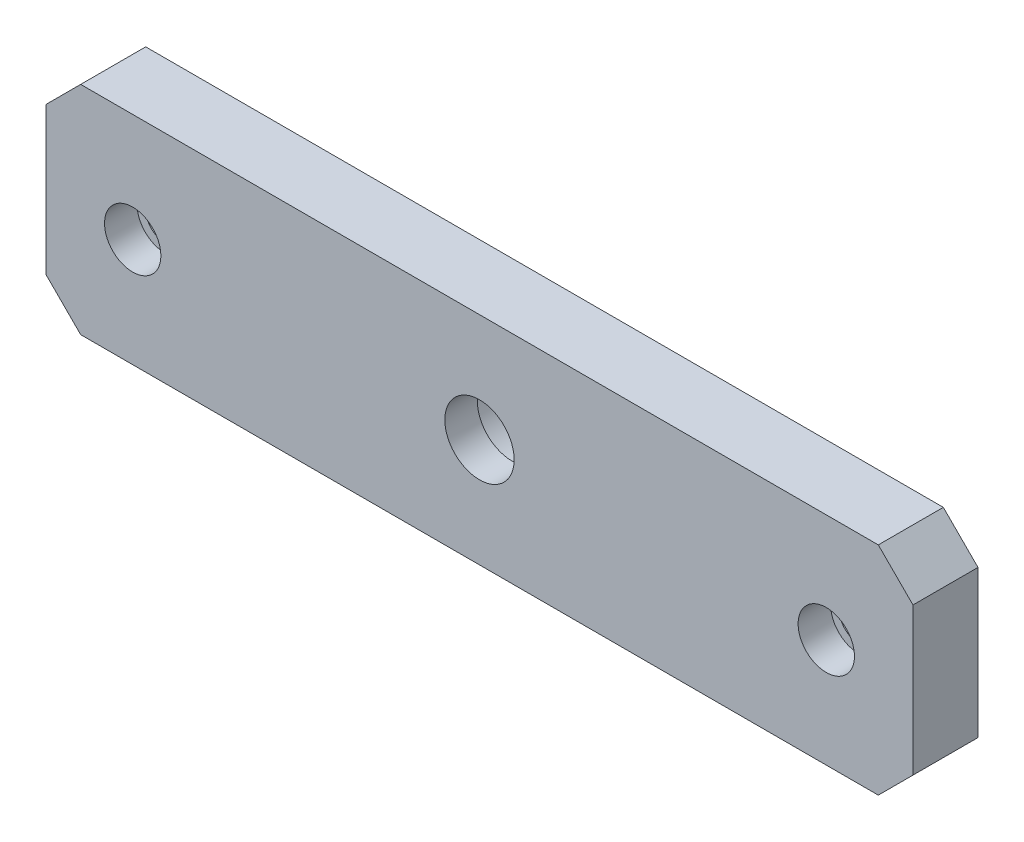
ISO-10303-21;
HEADER;
FILE_DESCRIPTION(('STEP AP214'),'2;1');
FILE_NAME('part.step','',(''),(''),'','','');
FILE_SCHEMA(('AUTOMOTIVE_DESIGN { 1 0 10303 214 1 1 1 1 }'));
ENDSEC;
DATA;
#1=APPLICATION_CONTEXT('core data for automotive mechanical design processes');
#2=APPLICATION_PROTOCOL_DEFINITION('international standard','automotive_design',2000,#1);
#3=PRODUCT_CONTEXT('',#1,'mechanical');
#4=PRODUCT('Part','Part','',(#3));
#5=PRODUCT_RELATED_PRODUCT_CATEGORY('part','',(#4));
#6=PRODUCT_DEFINITION_FORMATION('','',#4);
#7=PRODUCT_DEFINITION_CONTEXT('part definition',#1,'design');
#8=PRODUCT_DEFINITION('design','',#6,#7);
#9=PRODUCT_DEFINITION_SHAPE('','',#8);
#10=(LENGTH_UNIT() NAMED_UNIT(*) SI_UNIT(.MILLI.,.METRE.));
#11=(NAMED_UNIT(*) PLANE_ANGLE_UNIT() SI_UNIT($,.RADIAN.));
#12=(NAMED_UNIT(*) SI_UNIT($,.STERADIAN.) SOLID_ANGLE_UNIT());
#13=UNCERTAINTY_MEASURE_WITH_UNIT(LENGTH_MEASURE(1.E-05),#10,'distance_accuracy_value','');
#14=(GEOMETRIC_REPRESENTATION_CONTEXT(3) GLOBAL_UNCERTAINTY_ASSIGNED_CONTEXT((#13)) GLOBAL_UNIT_ASSIGNED_CONTEXT((#10,
#11,#12)) REPRESENTATION_CONTEXT('',''));
#15=CARTESIAN_POINT('',(0.,0.,0.));
#16=DIRECTION('',(0.,0.,1.));
#17=DIRECTION('',(1.,0.,0.));
#18=AXIS2_PLACEMENT_3D('',#15,#16,#17);
#19=CARTESIAN_POINT('',(100.,25.,0.));
#20=DIRECTION('',(0.,0.,1.));
#21=DIRECTION('',(1.,0.,0.));
#22=AXIS2_PLACEMENT_3D('',#19,#20,#21);
#23=CYLINDRICAL_SURFACE('',#22,8.00000000000001);
#24=CARTESIAN_POINT('',(100.,25.,15.));
#25=DIRECTION('',(0.,0.,1.));
#26=DIRECTION('',(1.,0.,0.));
#27=AXIS2_PLACEMENT_3D('',#24,#25,#26);
#28=CIRCLE('',#27,8.00000000000001);
#29=CARTESIAN_POINT('',(108.,25.,15.));
#30=VERTEX_POINT('',#29);
#31=EDGE_CURVE('E134',#30,#30,#28,.T.);
#32=ORIENTED_EDGE('',*,*,#31,.T.);
#33=EDGE_LOOP('',(#32));
#34=FACE_BOUND('',#33,.T.);
#35=CARTESIAN_POINT('',(100.,25.,7.5));
#36=DIRECTION('',(0.,0.,-1.));
#37=DIRECTION('',(-1.,0.,0.));
#38=AXIS2_PLACEMENT_3D('',#35,#36,#37);
#39=CIRCLE('',#38,8.00000000000001);
#40=CARTESIAN_POINT('',(92.,25.,7.5));
#41=VERTEX_POINT('',#40);
#42=EDGE_CURVE('E153',#41,#41,#39,.F.);
#43=ORIENTED_EDGE('',*,*,#42,.F.);
#44=EDGE_LOOP('',(#43));
#45=FACE_BOUND('',#44,.T.);
#46=ADVANCED_FACE('F36',(#34,#45),#23,.F.);
#47=CARTESIAN_POINT('',(180.,25.,0.));
#48=DIRECTION('',(0.,0.,1.));
#49=DIRECTION('',(1.,0.,0.));
#50=AXIS2_PLACEMENT_3D('',#47,#48,#49);
#51=CYLINDRICAL_SURFACE('',#50,4.49999999999999);
#52=CARTESIAN_POINT('',(180.,25.,0.));
#53=DIRECTION('',(0.,0.,1.));
#54=DIRECTION('',(1.,0.,0.));
#55=AXIS2_PLACEMENT_3D('',#52,#53,#54);
#56=CIRCLE('',#55,4.49999999999999);
#57=CARTESIAN_POINT('',(184.5,25.,0.));
#58=VERTEX_POINT('',#57);
#59=EDGE_CURVE('E146',#58,#58,#56,.T.);
#60=ORIENTED_EDGE('',*,*,#59,.F.);
#61=EDGE_LOOP('',(#60));
#62=FACE_BOUND('',#61,.T.);
#63=CARTESIAN_POINT('',(180.,25.,7.5));
#64=DIRECTION('',(0.,0.,1.));
#65=DIRECTION('',(1.,0.,0.));
#66=AXIS2_PLACEMENT_3D('',#63,#64,#65);
#67=CIRCLE('',#66,4.49999999999999);
#68=CARTESIAN_POINT('',(184.5,25.,7.5));
#69=VERTEX_POINT('',#68);
#70=EDGE_CURVE('E148',#69,#69,#67,.F.);
#71=ORIENTED_EDGE('',*,*,#70,.F.);
#72=EDGE_LOOP('',(#71));
#73=FACE_BOUND('',#72,.T.);
#74=ADVANCED_FACE('F234',(#62,#73),#51,.F.);
#75=CARTESIAN_POINT('',(20.,25.,0.));
#76=DIRECTION('',(0.,0.,1.));
#77=DIRECTION('',(1.,0.,0.));
#78=AXIS2_PLACEMENT_3D('',#75,#76,#77);
#79=CYLINDRICAL_SURFACE('',#78,4.5);
#80=CARTESIAN_POINT('',(20.,25.,0.));
#81=DIRECTION('',(0.,0.,1.));
#82=DIRECTION('',(1.,0.,0.));
#83=AXIS2_PLACEMENT_3D('',#80,#81,#82);
#84=CIRCLE('',#83,4.5);
#85=CARTESIAN_POINT('',(24.5,25.,0.));
#86=VERTEX_POINT('',#85);
#87=EDGE_CURVE('E128',#86,#86,#84,.T.);
#88=ORIENTED_EDGE('',*,*,#87,.F.);
#89=EDGE_LOOP('',(#88));
#90=FACE_BOUND('',#89,.T.);
#91=CARTESIAN_POINT('',(20.,25.,7.5));
#92=DIRECTION('',(0.,0.,1.));
#93=DIRECTION('',(1.,0.,0.));
#94=AXIS2_PLACEMENT_3D('',#91,#92,#93);
#95=CIRCLE('',#94,4.5);
#96=CARTESIAN_POINT('',(24.5,25.,7.5));
#97=VERTEX_POINT('',#96);
#98=EDGE_CURVE('E143',#97,#97,#95,.F.);
#99=ORIENTED_EDGE('',*,*,#98,.F.);
#100=EDGE_LOOP('',(#99));
#101=FACE_BOUND('',#100,.T.);
#102=ADVANCED_FACE('F231',(#90,#101),#79,.F.);
#103=CARTESIAN_POINT('',(0.,0.,15.));
#104=DIRECTION('',(1.,0.,0.));
#105=DIRECTION('',(0.,0.,-1.));
#106=AXIS2_PLACEMENT_3D('',#103,#104,#105);
#107=PLANE('',#106);
#108=DIRECTION('',(0.,-1.,0.));
#109=VECTOR('',#108,1.);
#110=CARTESIAN_POINT('',(0.,0.,15.));
#111=LINE('',#110,#109);
#112=CARTESIAN_POINT('',(0.,42.,15.));
#113=VERTEX_POINT('',#112);
#114=CARTESIAN_POINT('',(0.,8.00000000000006,15.));
#115=VERTEX_POINT('',#114);
#116=EDGE_CURVE('E121',#113,#115,#111,.T.);
#117=ORIENTED_EDGE('',*,*,#116,.F.);
#118=DIRECTION('',(0.,0.,-1.));
#119=VECTOR('',#118,1.);
#120=CARTESIAN_POINT('',(0.,42.,15.));
#121=LINE('',#120,#119);
#122=CARTESIAN_POINT('',(0.,42.,0.));
#123=VERTEX_POINT('',#122);
#124=EDGE_CURVE('E105',#113,#123,#121,.T.);
#125=ORIENTED_EDGE('',*,*,#124,.T.);
#126=DIRECTION('',(0.,-1.,0.));
#127=VECTOR('',#126,1.);
#128=CARTESIAN_POINT('',(0.,0.,0.));
#129=LINE('',#128,#127);
#130=CARTESIAN_POINT('',(0.,8.00000000000006,0.));
#131=VERTEX_POINT('',#130);
#132=EDGE_CURVE('E118',#123,#131,#129,.T.);
#133=ORIENTED_EDGE('',*,*,#132,.T.);
#134=DIRECTION('',(0.,0.,1.));
#135=VECTOR('',#134,1.);
#136=CARTESIAN_POINT('',(0.,8.00000000000006,15.));
#137=LINE('',#136,#135);
#138=EDGE_CURVE('E123',#131,#115,#137,.T.);
#139=ORIENTED_EDGE('',*,*,#138,.T.);
#140=EDGE_LOOP('',(#117,#125,#133,#139));
#141=FACE_BOUND('',#140,.T.);
#142=ADVANCED_FACE('F117',(#141),#107,.F.);
#143=CARTESIAN_POINT('',(0.,0.,15.));
#144=DIRECTION('',(0.,1.,0.));
#145=DIRECTION('',(0.,0.,1.));
#146=AXIS2_PLACEMENT_3D('',#143,#144,#145);
#147=PLANE('',#146);
#148=DIRECTION('',(1.,0.,0.));
#149=VECTOR('',#148,1.);
#150=CARTESIAN_POINT('',(0.,0.,15.));
#151=LINE('',#150,#149);
#152=CARTESIAN_POINT('',(8.,0.,15.));
#153=VERTEX_POINT('',#152);
#154=CARTESIAN_POINT('',(192.,0.,15.));
#155=VERTEX_POINT('',#154);
#156=EDGE_CURVE('E191',#153,#155,#151,.T.);
#157=ORIENTED_EDGE('',*,*,#156,.F.);
#158=DIRECTION('',(0.,0.,-1.));
#159=VECTOR('',#158,1.);
#160=CARTESIAN_POINT('',(8.00000000000001,0.,15.));
#161=LINE('',#160,#159);
#162=CARTESIAN_POINT('',(8.00000000000001,0.,0.));
#163=VERTEX_POINT('',#162);
#164=EDGE_CURVE('E175',#153,#163,#161,.T.);
#165=ORIENTED_EDGE('',*,*,#164,.T.);
#166=DIRECTION('',(1.,0.,0.));
#167=VECTOR('',#166,1.);
#168=CARTESIAN_POINT('',(0.,0.,0.));
#169=LINE('',#168,#167);
#170=CARTESIAN_POINT('',(192.,0.,0.));
#171=VERTEX_POINT('',#170);
#172=EDGE_CURVE('E127',#163,#171,#169,.T.);
#173=ORIENTED_EDGE('',*,*,#172,.T.);
#174=DIRECTION('',(0.,0.,1.));
#175=VECTOR('',#174,1.);
#176=CARTESIAN_POINT('',(192.,0.,15.));
#177=LINE('',#176,#175);
#178=EDGE_CURVE('E173',#171,#155,#177,.T.);
#179=ORIENTED_EDGE('',*,*,#178,.T.);
#180=EDGE_LOOP('',(#157,#165,#173,#179));
#181=FACE_BOUND('',#180,.T.);
#182=ADVANCED_FACE('F266',(#181),#147,.F.);
#183=CARTESIAN_POINT('',(200.,0.,15.));
#184=DIRECTION('',(-1.,0.,0.));
#185=DIRECTION('',(0.,0.,1.));
#186=AXIS2_PLACEMENT_3D('',#183,#184,#185);
#187=PLANE('',#186);
#188=DIRECTION('',(0.,1.,0.));
#189=VECTOR('',#188,1.);
#190=CARTESIAN_POINT('',(200.,0.,0.));
#191=LINE('',#190,#189);
#192=CARTESIAN_POINT('',(200.,8.00000000000006,0.));
#193=VERTEX_POINT('',#192);
#194=CARTESIAN_POINT('',(200.,41.9999999999999,0.));
#195=VERTEX_POINT('',#194);
#196=EDGE_CURVE('E131',#193,#195,#191,.T.);
#197=ORIENTED_EDGE('',*,*,#196,.T.);
#198=DIRECTION('',(0.,0.,1.));
#199=VECTOR('',#198,1.);
#200=CARTESIAN_POINT('',(200.,41.9999999999999,15.));
#201=LINE('',#200,#199);
#202=CARTESIAN_POINT('',(200.,41.9999999999999,15.));
#203=VERTEX_POINT('',#202);
#204=EDGE_CURVE('E11',#195,#203,#201,.T.);
#205=ORIENTED_EDGE('',*,*,#204,.T.);
#206=DIRECTION('',(0.,1.,0.));
#207=VECTOR('',#206,1.);
#208=CARTESIAN_POINT('',(200.,0.,15.));
#209=LINE('',#208,#207);
#210=CARTESIAN_POINT('',(200.,8.,15.));
#211=VERTEX_POINT('',#210);
#212=EDGE_CURVE('E181',#211,#203,#209,.T.);
#213=ORIENTED_EDGE('',*,*,#212,.F.);
#214=DIRECTION('',(0.,0.,-1.));
#215=VECTOR('',#214,1.);
#216=CARTESIAN_POINT('',(200.,8.00000000000001,15.));
#217=LINE('',#216,#215);
#218=EDGE_CURVE('E44',#211,#193,#217,.T.);
#219=ORIENTED_EDGE('',*,*,#218,.T.);
#220=EDGE_LOOP('',(#197,#205,#213,#219));
#221=FACE_BOUND('',#220,.T.);
#222=ADVANCED_FACE('F180',(#221),#187,.F.);
#223=CARTESIAN_POINT('',(0.,50.,15.));
#224=DIRECTION('',(0.,-1.,0.));
#225=DIRECTION('',(0.,0.,-1.));
#226=AXIS2_PLACEMENT_3D('',#223,#224,#225);
#227=PLANE('',#226);
#228=DIRECTION('',(-1.,0.,0.));
#229=VECTOR('',#228,1.);
#230=CARTESIAN_POINT('',(0.,50.,0.));
#231=LINE('',#230,#229);
#232=CARTESIAN_POINT('',(192.,50.,0.));
#233=VERTEX_POINT('',#232);
#234=CARTESIAN_POINT('',(8.00000000000004,50.,0.));
#235=VERTEX_POINT('',#234);
#236=EDGE_CURVE('E141',#233,#235,#231,.T.);
#237=ORIENTED_EDGE('',*,*,#236,.T.);
#238=DIRECTION('',(0.,0.,1.));
#239=VECTOR('',#238,1.);
#240=CARTESIAN_POINT('',(8.00000000000004,50.,15.));
#241=LINE('',#240,#239);
#242=CARTESIAN_POINT('',(8.00000000000004,50.,15.));
#243=VERTEX_POINT('',#242);
#244=EDGE_CURVE('E106',#235,#243,#241,.T.);
#245=ORIENTED_EDGE('',*,*,#244,.T.);
#246=DIRECTION('',(-1.,0.,0.));
#247=VECTOR('',#246,1.);
#248=CARTESIAN_POINT('',(0.,50.,15.));
#249=LINE('',#248,#247);
#250=CARTESIAN_POINT('',(192.,50.,15.));
#251=VERTEX_POINT('',#250);
#252=EDGE_CURVE('E137',#251,#243,#249,.T.);
#253=ORIENTED_EDGE('',*,*,#252,.F.);
#254=DIRECTION('',(0.,0.,-1.));
#255=VECTOR('',#254,1.);
#256=CARTESIAN_POINT('',(192.,50.,15.));
#257=LINE('',#256,#255);
#258=EDGE_CURVE('E111',#251,#233,#257,.T.);
#259=ORIENTED_EDGE('',*,*,#258,.T.);
#260=EDGE_LOOP('',(#237,#245,#253,#259));
#261=FACE_BOUND('',#260,.T.);
#262=ADVANCED_FACE('F189',(#261),#227,.F.);
#263=CARTESIAN_POINT('',(0.,0.,15.));
#264=DIRECTION('',(0.,0.,-1.));
#265=DIRECTION('',(-1.,0.,0.));
#266=AXIS2_PLACEMENT_3D('',#263,#264,#265);
#267=PLANE('',#266);
#268=CARTESIAN_POINT('',(180.,25.,15.));
#269=DIRECTION('',(0.,0.,1.));
#270=DIRECTION('',(1.,0.,0.));
#271=AXIS2_PLACEMENT_3D('',#268,#269,#270);
#272=CIRCLE('',#271,6.50000000000002);
#273=CARTESIAN_POINT('',(186.5,25.,15.));
#274=VERTEX_POINT('',#273);
#275=EDGE_CURVE('E156',#274,#274,#272,.T.);
#276=ORIENTED_EDGE('',*,*,#275,.F.);
#277=EDGE_LOOP('',(#276));
#278=FACE_BOUND('',#277,.T.);
#279=CARTESIAN_POINT('',(20.,25.,15.));
#280=DIRECTION('',(0.,0.,1.));
#281=DIRECTION('',(1.,0.,0.));
#282=AXIS2_PLACEMENT_3D('',#279,#280,#281);
#283=CIRCLE('',#282,6.5);
#284=CARTESIAN_POINT('',(26.5,25.,15.));
#285=VERTEX_POINT('',#284);
#286=EDGE_CURVE('E151',#285,#285,#283,.T.);
#287=ORIENTED_EDGE('',*,*,#286,.F.);
#288=EDGE_LOOP('',(#287));
#289=FACE_BOUND('',#288,.T.);
#290=ORIENTED_EDGE('',*,*,#31,.F.);
#291=EDGE_LOOP('',(#290));
#292=FACE_BOUND('',#291,.T.);
#293=ORIENTED_EDGE('',*,*,#252,.T.);
#294=DIRECTION('',(0.70710678118655,0.707106781186545,0.));
#295=VECTOR('',#294,1.);
#296=CARTESIAN_POINT('',(0.,42.,15.));
#297=LINE('',#296,#295);
#298=EDGE_CURVE('E171',#243,#113,#297,.F.);
#299=ORIENTED_EDGE('',*,*,#298,.T.);
#300=ORIENTED_EDGE('',*,*,#116,.T.);
#301=DIRECTION('',(-0.707106781186545,0.70710678118655,0.));
#302=VECTOR('',#301,1.);
#303=CARTESIAN_POINT('',(8.00000000000001,0.,15.));
#304=LINE('',#303,#302);
#305=EDGE_CURVE('E169',#115,#153,#304,.F.);
#306=ORIENTED_EDGE('',*,*,#305,.T.);
#307=ORIENTED_EDGE('',*,*,#156,.T.);
#308=DIRECTION('',(-0.70710678118655,-0.707106781186545,0.));
#309=VECTOR('',#308,1.);
#310=CARTESIAN_POINT('',(200.,8.00000000000001,15.));
#311=LINE('',#310,#309);
#312=EDGE_CURVE('E56',#155,#211,#311,.F.);
#313=ORIENTED_EDGE('',*,*,#312,.T.);
#314=ORIENTED_EDGE('',*,*,#212,.T.);
#315=DIRECTION('',(0.707106781186546,-0.707106781186549,0.));
#316=VECTOR('',#315,1.);
#317=CARTESIAN_POINT('',(192.,50.,15.));
#318=LINE('',#317,#316);
#319=EDGE_CURVE('E167',#203,#251,#318,.F.);
#320=ORIENTED_EDGE('',*,*,#319,.T.);
#321=EDGE_LOOP('',(#293,#299,#300,#306,#307,#313,#314,#320));
#322=FACE_BOUND('',#321,.T.);
#323=ADVANCED_FACE('F225',(#278,#289,#292,#322),#267,.F.);
#324=CARTESIAN_POINT('',(0.,0.,0.));
#325=DIRECTION('',(0.,0.,-1.));
#326=DIRECTION('',(-1.,0.,0.));
#327=AXIS2_PLACEMENT_3D('',#324,#325,#326);
#328=PLANE('',#327);
#329=CARTESIAN_POINT('',(100.,25.,0.));
#330=DIRECTION('',(0.,0.,-1.));
#331=DIRECTION('',(-1.,0.,0.));
#332=AXIS2_PLACEMENT_3D('',#329,#330,#331);
#333=CIRCLE('',#332,12.);
#334=CARTESIAN_POINT('',(88.,25.,0.));
#335=VERTEX_POINT('',#334);
#336=EDGE_CURVE('E207',#335,#335,#333,.T.);
#337=ORIENTED_EDGE('',*,*,#336,.F.);
#338=EDGE_LOOP('',(#337));
#339=FACE_BOUND('',#338,.T.);
#340=ORIENTED_EDGE('',*,*,#59,.T.);
#341=EDGE_LOOP('',(#340));
#342=FACE_BOUND('',#341,.T.);
#343=ORIENTED_EDGE('',*,*,#87,.T.);
#344=EDGE_LOOP('',(#343));
#345=FACE_BOUND('',#344,.T.);
#346=ORIENTED_EDGE('',*,*,#132,.F.);
#347=DIRECTION('',(-0.70710678118655,-0.707106781186545,0.));
#348=VECTOR('',#347,1.);
#349=CARTESIAN_POINT('',(-21.,21.0000000000002,0.));
#350=LINE('',#349,#348);
#351=EDGE_CURVE('E101',#123,#235,#350,.F.);
#352=ORIENTED_EDGE('',*,*,#351,.T.);
#353=ORIENTED_EDGE('',*,*,#236,.F.);
#354=DIRECTION('',(-0.707106781186546,0.707106781186549,0.));
#355=VECTOR('',#354,1.);
#356=CARTESIAN_POINT('',(121.,121.,0.));
#357=LINE('',#356,#355);
#358=EDGE_CURVE('E160',#233,#195,#357,.F.);
#359=ORIENTED_EDGE('',*,*,#358,.T.);
#360=ORIENTED_EDGE('',*,*,#196,.F.);
#361=DIRECTION('',(0.70710678118655,0.707106781186545,0.));
#362=VECTOR('',#361,1.);
#363=CARTESIAN_POINT('',(95.9999999999993,-96.,0.));
#364=LINE('',#363,#362);
#365=EDGE_CURVE('E122',#193,#171,#364,.F.);
#366=ORIENTED_EDGE('',*,*,#365,.T.);
#367=ORIENTED_EDGE('',*,*,#172,.F.);
#368=DIRECTION('',(0.707106781186545,-0.70710678118655,0.));
#369=VECTOR('',#368,1.);
#370=CARTESIAN_POINT('',(4.00000000000003,4.,0.));
#371=LINE('',#370,#369);
#372=EDGE_CURVE('E112',#163,#131,#371,.F.);
#373=ORIENTED_EDGE('',*,*,#372,.T.);
#374=EDGE_LOOP('',(#346,#352,#353,#359,#360,#366,#367,#373));
#375=FACE_BOUND('',#374,.T.);
#376=ADVANCED_FACE('F125',(#339,#342,#345,#375),#328,.T.);
#377=CARTESIAN_POINT('',(20.,25.,7.5));
#378=DIRECTION('',(0.,0.,1.));
#379=DIRECTION('',(1.,0.,0.));
#380=AXIS2_PLACEMENT_3D('',#377,#378,#379);
#381=PLANE('',#380);
#382=CARTESIAN_POINT('',(20.,25.,7.5));
#383=DIRECTION('',(0.,0.,1.));
#384=DIRECTION('',(1.,0.,0.));
#385=AXIS2_PLACEMENT_3D('',#382,#383,#384);
#386=CIRCLE('',#385,6.5);
#387=CARTESIAN_POINT('',(26.5,25.,7.5));
#388=VERTEX_POINT('',#387);
#389=EDGE_CURVE('E147',#388,#388,#386,.T.);
#390=ORIENTED_EDGE('',*,*,#389,.T.);
#391=EDGE_LOOP('',(#390));
#392=FACE_BOUND('',#391,.T.);
#393=ORIENTED_EDGE('',*,*,#98,.T.);
#394=EDGE_LOOP('',(#393));
#395=FACE_BOUND('',#394,.T.);
#396=ADVANCED_FACE('F224',(#392,#395),#381,.T.);
#397=CARTESIAN_POINT('',(20.,25.,7.5));
#398=DIRECTION('',(0.,0.,1.));
#399=DIRECTION('',(1.,0.,0.));
#400=AXIS2_PLACEMENT_3D('',#397,#398,#399);
#401=CYLINDRICAL_SURFACE('',#400,6.5);
#402=ORIENTED_EDGE('',*,*,#389,.F.);
#403=EDGE_LOOP('',(#402));
#404=FACE_BOUND('',#403,.T.);
#405=ORIENTED_EDGE('',*,*,#286,.T.);
#406=EDGE_LOOP('',(#405));
#407=FACE_BOUND('',#406,.T.);
#408=ADVANCED_FACE('F239',(#404,#407),#401,.F.);
#409=CARTESIAN_POINT('',(180.,25.,7.5));
#410=DIRECTION('',(0.,0.,1.));
#411=DIRECTION('',(1.,0.,0.));
#412=AXIS2_PLACEMENT_3D('',#409,#410,#411);
#413=PLANE('',#412);
#414=CARTESIAN_POINT('',(180.,25.,7.5));
#415=DIRECTION('',(0.,0.,1.));
#416=DIRECTION('',(1.,0.,0.));
#417=AXIS2_PLACEMENT_3D('',#414,#415,#416);
#418=CIRCLE('',#417,6.50000000000002);
#419=CARTESIAN_POINT('',(186.5,25.,7.5));
#420=VERTEX_POINT('',#419);
#421=EDGE_CURVE('E152',#420,#420,#418,.T.);
#422=ORIENTED_EDGE('',*,*,#421,.T.);
#423=EDGE_LOOP('',(#422));
#424=FACE_BOUND('',#423,.T.);
#425=ORIENTED_EDGE('',*,*,#70,.T.);
#426=EDGE_LOOP('',(#425));
#427=FACE_BOUND('',#426,.T.);
#428=ADVANCED_FACE('F245',(#424,#427),#413,.T.);
#429=CARTESIAN_POINT('',(180.,25.,7.5));
#430=DIRECTION('',(0.,0.,1.));
#431=DIRECTION('',(1.,0.,0.));
#432=AXIS2_PLACEMENT_3D('',#429,#430,#431);
#433=CYLINDRICAL_SURFACE('',#432,6.50000000000002);
#434=ORIENTED_EDGE('',*,*,#421,.F.);
#435=EDGE_LOOP('',(#434));
#436=FACE_BOUND('',#435,.T.);
#437=ORIENTED_EDGE('',*,*,#275,.T.);
#438=EDGE_LOOP('',(#437));
#439=FACE_BOUND('',#438,.T.);
#440=ADVANCED_FACE('F320',(#436,#439),#433,.F.);
#441=CARTESIAN_POINT('',(100.,25.,7.5));
#442=DIRECTION('',(0.,0.,-1.));
#443=DIRECTION('',(-1.,0.,0.));
#444=AXIS2_PLACEMENT_3D('',#441,#442,#443);
#445=PLANE('',#444);
#446=CARTESIAN_POINT('',(100.,25.,7.5));
#447=DIRECTION('',(0.,0.,-1.));
#448=DIRECTION('',(-1.,0.,0.));
#449=AXIS2_PLACEMENT_3D('',#446,#447,#448);
#450=CIRCLE('',#449,12.);
#451=CARTESIAN_POINT('',(88.,25.,7.5));
#452=VERTEX_POINT('',#451);
#453=EDGE_CURVE('E157',#452,#452,#450,.T.);
#454=ORIENTED_EDGE('',*,*,#453,.T.);
#455=EDGE_LOOP('',(#454));
#456=FACE_BOUND('',#455,.T.);
#457=ORIENTED_EDGE('',*,*,#42,.T.);
#458=EDGE_LOOP('',(#457));
#459=FACE_BOUND('',#458,.T.);
#460=ADVANCED_FACE('F213',(#456,#459),#445,.T.);
#461=CARTESIAN_POINT('',(100.,25.,7.5));
#462=DIRECTION('',(0.,0.,-1.));
#463=DIRECTION('',(-1.,0.,0.));
#464=AXIS2_PLACEMENT_3D('',#461,#462,#463);
#465=CYLINDRICAL_SURFACE('',#464,12.);
#466=ORIENTED_EDGE('',*,*,#453,.F.);
#467=EDGE_LOOP('',(#466));
#468=FACE_BOUND('',#467,.T.);
#469=ORIENTED_EDGE('',*,*,#336,.T.);
#470=EDGE_LOOP('',(#469));
#471=FACE_BOUND('',#470,.T.);
#472=ADVANCED_FACE('F216',(#468,#471),#465,.F.);
#473=CARTESIAN_POINT('',(0.,42.,15.));
#474=DIRECTION('',(0.707106781186545,-0.70710678118655,0.));
#475=DIRECTION('',(0.,0.,-1.));
#476=AXIS2_PLACEMENT_3D('',#473,#474,#475);
#477=PLANE('',#476);
#478=ORIENTED_EDGE('',*,*,#298,.F.);
#479=ORIENTED_EDGE('',*,*,#244,.F.);
#480=ORIENTED_EDGE('',*,*,#351,.F.);
#481=ORIENTED_EDGE('',*,*,#124,.F.);
#482=EDGE_LOOP('',(#478,#479,#480,#481));
#483=FACE_BOUND('',#482,.T.);
#484=ADVANCED_FACE('F104',(#483),#477,.F.);
#485=CARTESIAN_POINT('',(8.00000000000001,0.,15.));
#486=DIRECTION('',(0.70710678118655,0.707106781186545,0.));
#487=DIRECTION('',(0.,0.,-1.));
#488=AXIS2_PLACEMENT_3D('',#485,#486,#487);
#489=PLANE('',#488);
#490=ORIENTED_EDGE('',*,*,#305,.F.);
#491=ORIENTED_EDGE('',*,*,#138,.F.);
#492=ORIENTED_EDGE('',*,*,#372,.F.);
#493=ORIENTED_EDGE('',*,*,#164,.F.);
#494=EDGE_LOOP('',(#490,#491,#492,#493));
#495=FACE_BOUND('',#494,.T.);
#496=ADVANCED_FACE('F274',(#495),#489,.F.);
#497=CARTESIAN_POINT('',(192.,50.,15.));
#498=DIRECTION('',(-0.707106781186549,-0.707106781186546,0.));
#499=DIRECTION('',(0.,0.,-1.));
#500=AXIS2_PLACEMENT_3D('',#497,#498,#499);
#501=PLANE('',#500);
#502=ORIENTED_EDGE('',*,*,#319,.F.);
#503=ORIENTED_EDGE('',*,*,#204,.F.);
#504=ORIENTED_EDGE('',*,*,#358,.F.);
#505=ORIENTED_EDGE('',*,*,#258,.F.);
#506=EDGE_LOOP('',(#502,#503,#504,#505));
#507=FACE_BOUND('',#506,.T.);
#508=ADVANCED_FACE('F186',(#507),#501,.F.);
#509=CARTESIAN_POINT('',(200.,8.00000000000001,15.));
#510=DIRECTION('',(-0.707106781186545,0.70710678118655,0.));
#511=DIRECTION('',(0.,0.,-1.));
#512=AXIS2_PLACEMENT_3D('',#509,#510,#511);
#513=PLANE('',#512);
#514=ORIENTED_EDGE('',*,*,#312,.F.);
#515=ORIENTED_EDGE('',*,*,#178,.F.);
#516=ORIENTED_EDGE('',*,*,#365,.F.);
#517=ORIENTED_EDGE('',*,*,#218,.F.);
#518=EDGE_LOOP('',(#514,#515,#516,#517));
#519=FACE_BOUND('',#518,.T.);
#520=ADVANCED_FACE('F38',(#519),#513,.F.);
#521=CLOSED_SHELL('',(#46,#74,#102,#142,#182,#222,#262,#323,#376,#396,#408,#428,#440,#460,#472,
#484,#496,#508,#520));
#522=MANIFOLD_SOLID_BREP('B2',#521);
#523=ADVANCED_BREP_SHAPE_REPRESENTATION('',(#18,#522),#14);
#524=SHAPE_DEFINITION_REPRESENTATION(#9,#523);
ENDSEC;
END-ISO-10303-21;
